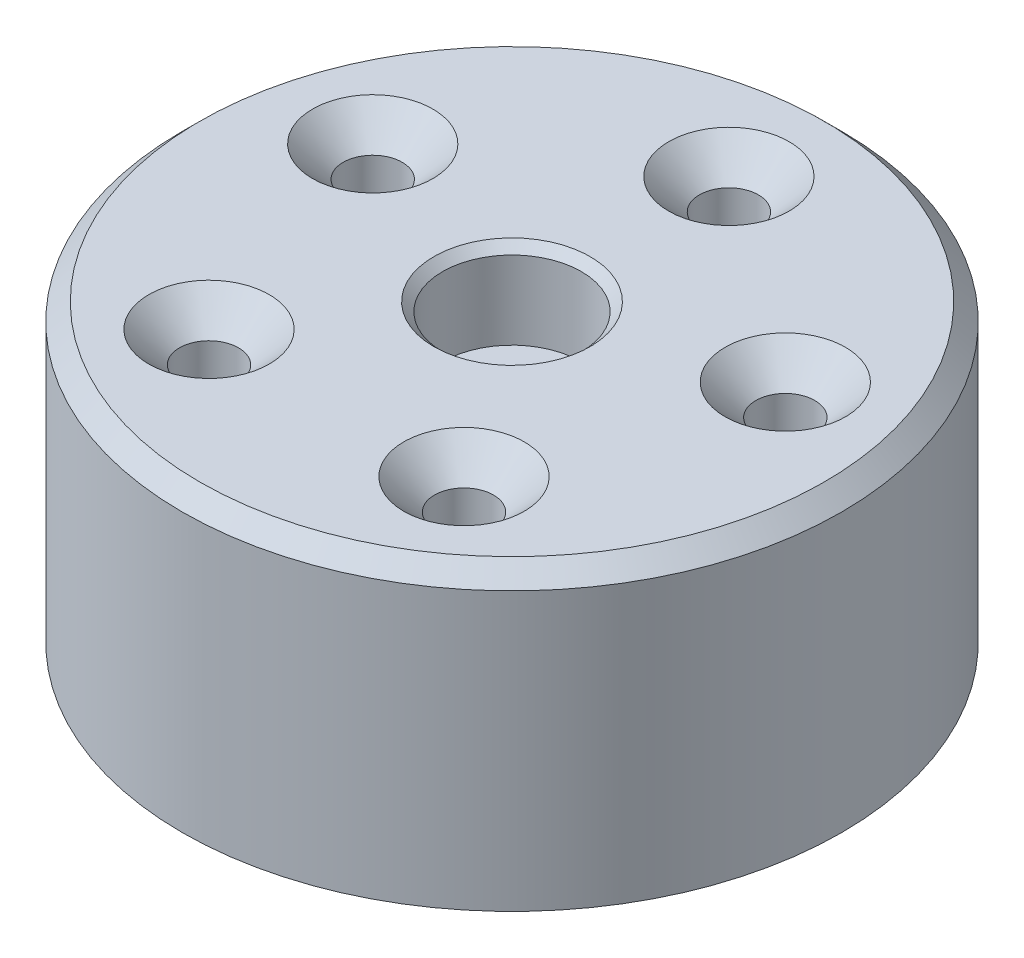
ISO-10303-21;
HEADER;
FILE_DESCRIPTION(('STEP AP214'),'2;1');
FILE_NAME('part.step','',(''),(''),'','','');
FILE_SCHEMA(('AUTOMOTIVE_DESIGN { 1 0 10303 214 1 1 1 1 }'));
ENDSEC;
DATA;
#1=APPLICATION_CONTEXT('core data for automotive mechanical design processes');
#2=APPLICATION_PROTOCOL_DEFINITION('international standard','automotive_design',2000,#1);
#3=PRODUCT_CONTEXT('',#1,'mechanical');
#4=PRODUCT('Part','Part','',(#3));
#5=PRODUCT_RELATED_PRODUCT_CATEGORY('part','',(#4));
#6=PRODUCT_DEFINITION_FORMATION('','',#4);
#7=PRODUCT_DEFINITION_CONTEXT('part definition',#1,'design');
#8=PRODUCT_DEFINITION('design','',#6,#7);
#9=PRODUCT_DEFINITION_SHAPE('','',#8);
#10=(LENGTH_UNIT() NAMED_UNIT(*) SI_UNIT(.MILLI.,.METRE.));
#11=(NAMED_UNIT(*) PLANE_ANGLE_UNIT() SI_UNIT($,.RADIAN.));
#12=(NAMED_UNIT(*) SI_UNIT($,.STERADIAN.) SOLID_ANGLE_UNIT());
#13=UNCERTAINTY_MEASURE_WITH_UNIT(LENGTH_MEASURE(1.E-05),#10,'distance_accuracy_value','');
#14=(GEOMETRIC_REPRESENTATION_CONTEXT(3) GLOBAL_UNCERTAINTY_ASSIGNED_CONTEXT((#13)) GLOBAL_UNIT_ASSIGNED_CONTEXT((#10,
#11,#12)) REPRESENTATION_CONTEXT('',''));
#15=CARTESIAN_POINT('',(0.,0.,0.));
#16=DIRECTION('',(0.,0.,1.));
#17=DIRECTION('',(1.,0.,0.));
#18=AXIS2_PLACEMENT_3D('',#15,#16,#17);
#19=CARTESIAN_POINT('',(0.,0.,0.));
#20=DIRECTION('',(0.,-1.,0.));
#21=DIRECTION('',(0.,0.,-1.));
#22=AXIS2_PLACEMENT_3D('',#19,#20,#21);
#23=CYLINDRICAL_SURFACE('',#22,17.);
#24=CARTESIAN_POINT('',(0.,0.,0.));
#25=DIRECTION('',(0.,-1.,0.));
#26=DIRECTION('',(0.,0.,-1.));
#27=AXIS2_PLACEMENT_3D('',#24,#25,#26);
#28=CIRCLE('',#27,17.);
#29=CARTESIAN_POINT('',(0.,0.,-17.));
#30=VERTEX_POINT('',#29);
#31=EDGE_CURVE('E77',#30,#30,#28,.T.);
#32=ORIENTED_EDGE('',*,*,#31,.T.);
#33=EDGE_LOOP('',(#32));
#34=FACE_BOUND('',#33,.T.);
#35=CARTESIAN_POINT('',(0.,2.,0.));
#36=DIRECTION('',(0.,-1.,0.));
#37=DIRECTION('',(0.,0.,-1.));
#38=AXIS2_PLACEMENT_3D('',#35,#36,#37);
#39=CIRCLE('',#38,17.);
#40=CARTESIAN_POINT('',(0.,2.,-17.));
#41=VERTEX_POINT('',#40);
#42=EDGE_CURVE('E106',#41,#41,#39,.T.);
#43=ORIENTED_EDGE('',*,*,#42,.F.);
#44=EDGE_LOOP('',(#43));
#45=FACE_BOUND('',#44,.T.);
#46=ADVANCED_FACE('F44',(#34,#45),#23,.F.);
#47=CARTESIAN_POINT('',(17.,0.,0.));
#48=DIRECTION('',(0.,-1.,0.));
#49=DIRECTION('',(0.,0.,-1.));
#50=AXIS2_PLACEMENT_3D('',#47,#48,#49);
#51=PLANE('',#50);
#52=CARTESIAN_POINT('',(0.,0.,0.));
#53=DIRECTION('',(0.,-1.,0.));
#54=DIRECTION('',(0.,0.,-1.));
#55=AXIS2_PLACEMENT_3D('',#52,#53,#54);
#56=CIRCLE('',#55,19.);
#57=CARTESIAN_POINT('',(0.,0.,-19.));
#58=VERTEX_POINT('',#57);
#59=EDGE_CURVE('E111',#58,#58,#56,.T.);
#60=ORIENTED_EDGE('',*,*,#59,.T.);
#61=EDGE_LOOP('',(#60));
#62=FACE_BOUND('',#61,.T.);
#63=ORIENTED_EDGE('',*,*,#31,.F.);
#64=EDGE_LOOP('',(#63));
#65=FACE_BOUND('',#64,.T.);
#66=ADVANCED_FACE('F179',(#62,#65),#51,.T.);
#67=CARTESIAN_POINT('',(0.,0.,0.));
#68=DIRECTION('',(0.,-1.,0.));
#69=DIRECTION('',(0.,0.,-1.));
#70=AXIS2_PLACEMENT_3D('',#67,#68,#69);
#71=CYLINDRICAL_SURFACE('',#70,19.);
#72=CARTESIAN_POINT('',(0.,16.,0.));
#73=DIRECTION('',(0.,1.,0.));
#74=DIRECTION('',(0.,0.,1.));
#75=AXIS2_PLACEMENT_3D('',#72,#73,#74);
#76=CIRCLE('',#75,19.);
#77=CARTESIAN_POINT('',(0.,16.,19.));
#78=VERTEX_POINT('',#77);
#79=EDGE_CURVE('E63',#78,#78,#76,.F.);
#80=ORIENTED_EDGE('',*,*,#79,.T.);
#81=EDGE_LOOP('',(#80));
#82=FACE_BOUND('',#81,.T.);
#83=ORIENTED_EDGE('',*,*,#59,.F.);
#84=EDGE_LOOP('',(#83));
#85=FACE_BOUND('',#84,.T.);
#86=ADVANCED_FACE('F185',(#82,#85),#71,.T.);
#87=CARTESIAN_POINT('',(19.,17.,0.));
#88=DIRECTION('',(0.,1.,0.));
#89=DIRECTION('',(0.,0.,1.));
#90=AXIS2_PLACEMENT_3D('',#87,#88,#89);
#91=PLANE('',#90);
#92=CARTESIAN_POINT('',(0.,17.,0.));
#93=DIRECTION('',(0.,1.,0.));
#94=DIRECTION('',(0.,0.,1.));
#95=AXIS2_PLACEMENT_3D('',#92,#93,#94);
#96=CIRCLE('',#95,4.5);
#97=CARTESIAN_POINT('',(0.,17.,4.5));
#98=VERTEX_POINT('',#97);
#99=EDGE_CURVE('E53',#98,#98,#96,.F.);
#100=ORIENTED_EDGE('',*,*,#99,.T.);
#101=EDGE_LOOP('',(#100));
#102=FACE_BOUND('',#101,.T.);
#103=CARTESIAN_POINT('',(0.,17.,0.));
#104=DIRECTION('',(0.,1.,0.));
#105=DIRECTION('',(0.,0.,1.));
#106=AXIS2_PLACEMENT_3D('',#103,#104,#105);
#107=CIRCLE('',#106,18.);
#108=CARTESIAN_POINT('',(0.,17.,18.));
#109=VERTEX_POINT('',#108);
#110=EDGE_CURVE('E58',#109,#109,#107,.T.);
#111=ORIENTED_EDGE('',*,*,#110,.T.);
#112=EDGE_LOOP('',(#111));
#113=FACE_BOUND('',#112,.T.);
#114=CARTESIAN_POINT('',(0.,17.,-12.5));
#115=DIRECTION('',(0.,1.,0.));
#116=DIRECTION('',(0.,0.,1.));
#117=AXIS2_PLACEMENT_3D('',#114,#115,#116);
#118=CIRCLE('',#117,3.47);
#119=CARTESIAN_POINT('',(0.,17.,-9.03));
#120=VERTEX_POINT('',#119);
#121=EDGE_CURVE('E149',#120,#120,#118,.T.);
#122=ORIENTED_EDGE('',*,*,#121,.F.);
#123=EDGE_LOOP('',(#122));
#124=FACE_BOUND('',#123,.T.);
#125=CARTESIAN_POINT('',(11.8882064536898,17.,-3.86271242968735));
#126=DIRECTION('',(0.,1.,0.));
#127=DIRECTION('',(0.,0.,1.));
#128=AXIS2_PLACEMENT_3D('',#125,#126,#127);
#129=CIRCLE('',#128,3.47);
#130=CARTESIAN_POINT('',(11.8882064536898,17.,-0.392712429687347));
#131=VERTEX_POINT('',#130);
#132=EDGE_CURVE('E82',#131,#131,#129,.T.);
#133=ORIENTED_EDGE('',*,*,#132,.F.);
#134=EDGE_LOOP('',(#133));
#135=FACE_BOUND('',#134,.T.);
#136=CARTESIAN_POINT('',(7.34731565365687,17.,10.1127124296865));
#137=DIRECTION('',(0.,1.,0.));
#138=DIRECTION('',(0.,0.,1.));
#139=AXIS2_PLACEMENT_3D('',#136,#137,#138);
#140=CIRCLE('',#139,3.47);
#141=CARTESIAN_POINT('',(7.34731565365687,17.,13.5827124296865));
#142=VERTEX_POINT('',#141);
#143=EDGE_CURVE('E88',#142,#142,#140,.T.);
#144=ORIENTED_EDGE('',*,*,#143,.F.);
#145=EDGE_LOOP('',(#144));
#146=FACE_BOUND('',#145,.T.);
#147=CARTESIAN_POINT('',(-7.34731565365496,17.,10.1127124296872));
#148=DIRECTION('',(0.,1.,0.));
#149=DIRECTION('',(0.,0.,1.));
#150=AXIS2_PLACEMENT_3D('',#147,#148,#149);
#151=CIRCLE('',#150,3.47);
#152=CARTESIAN_POINT('',(-7.34731565365496,17.,13.5827124296872));
#153=VERTEX_POINT('',#152);
#154=EDGE_CURVE('E94',#153,#153,#151,.T.);
#155=ORIENTED_EDGE('',*,*,#154,.F.);
#156=EDGE_LOOP('',(#155));
#157=FACE_BOUND('',#156,.T.);
#158=CARTESIAN_POINT('',(-11.8882064536891,17.,-3.86271242968634));
#159=DIRECTION('',(0.,1.,0.));
#160=DIRECTION('',(0.,0.,1.));
#161=AXIS2_PLACEMENT_3D('',#158,#159,#160);
#162=CIRCLE('',#161,3.47);
#163=CARTESIAN_POINT('',(-11.8882064536891,17.,-0.39271242968634));
#164=VERTEX_POINT('',#163);
#165=EDGE_CURVE('E100',#164,#164,#162,.T.);
#166=ORIENTED_EDGE('',*,*,#165,.F.);
#167=EDGE_LOOP('',(#166));
#168=FACE_BOUND('',#167,.T.);
#169=ADVANCED_FACE('F214',(#102,#113,#124,#135,#146,#157,#168),#91,.T.);
#170=CARTESIAN_POINT('',(0.,0.,0.));
#171=DIRECTION('',(0.,-1.,0.));
#172=DIRECTION('',(0.,0.,-1.));
#173=AXIS2_PLACEMENT_3D('',#170,#171,#172);
#174=CYLINDRICAL_SURFACE('',#173,4.);
#175=CARTESIAN_POINT('',(0.,16.5,0.));
#176=DIRECTION('',(0.,1.,0.));
#177=DIRECTION('',(0.,0.,1.));
#178=AXIS2_PLACEMENT_3D('',#175,#176,#177);
#179=CIRCLE('',#178,4.);
#180=CARTESIAN_POINT('',(0.,16.5,4.));
#181=VERTEX_POINT('',#180);
#182=EDGE_CURVE('E10',#181,#181,#179,.T.);
#183=ORIENTED_EDGE('',*,*,#182,.T.);
#184=EDGE_LOOP('',(#183));
#185=FACE_BOUND('',#184,.T.);
#186=CARTESIAN_POINT('',(0.,12.,0.));
#187=DIRECTION('',(0.,-1.,0.));
#188=DIRECTION('',(0.,0.,-1.));
#189=AXIS2_PLACEMENT_3D('',#186,#187,#188);
#190=CIRCLE('',#189,4.);
#191=CARTESIAN_POINT('',(0.,12.,-4.));
#192=VERTEX_POINT('',#191);
#193=EDGE_CURVE('E115',#192,#192,#190,.T.);
#194=ORIENTED_EDGE('',*,*,#193,.T.);
#195=EDGE_LOOP('',(#194));
#196=FACE_BOUND('',#195,.T.);
#197=ADVANCED_FACE('F220',(#185,#196),#174,.F.);
#198=CARTESIAN_POINT('',(4.,12.,0.));
#199=DIRECTION('',(0.,1.,0.));
#200=DIRECTION('',(0.,0.,1.));
#201=AXIS2_PLACEMENT_3D('',#198,#199,#200);
#202=PLANE('',#201);
#203=ORIENTED_EDGE('',*,*,#193,.F.);
#204=EDGE_LOOP('',(#203));
#205=FACE_BOUND('',#204,.T.);
#206=ADVANCED_FACE('F164',(#205),#202,.T.);
#207=CARTESIAN_POINT('',(0.,2.,0.));
#208=DIRECTION('',(0.,-1.,0.));
#209=DIRECTION('',(0.,0.,-1.));
#210=AXIS2_PLACEMENT_3D('',#207,#208,#209);
#211=PLANE('',#210);
#212=CARTESIAN_POINT('',(0.,2.,0.));
#213=DIRECTION('',(0.,-1.,0.));
#214=DIRECTION('',(0.,0.,-1.));
#215=AXIS2_PLACEMENT_3D('',#212,#213,#214);
#216=CIRCLE('',#215,7.5);
#217=CARTESIAN_POINT('',(0.,2.,-7.5));
#218=VERTEX_POINT('',#217);
#219=EDGE_CURVE('E153',#218,#218,#216,.T.);
#220=ORIENTED_EDGE('',*,*,#219,.F.);
#221=EDGE_LOOP('',(#220));
#222=FACE_BOUND('',#221,.T.);
#223=CARTESIAN_POINT('',(0.,2.,-12.5));
#224=DIRECTION('',(0.,-1.,0.));
#225=DIRECTION('',(0.,0.,-1.));
#226=AXIS2_PLACEMENT_3D('',#223,#224,#225);
#227=CIRCLE('',#226,1.7);
#228=CARTESIAN_POINT('',(0.,2.,-14.2));
#229=VERTEX_POINT('',#228);
#230=EDGE_CURVE('E78',#229,#229,#227,.T.);
#231=ORIENTED_EDGE('',*,*,#230,.F.);
#232=EDGE_LOOP('',(#231));
#233=FACE_BOUND('',#232,.T.);
#234=CARTESIAN_POINT('',(11.8882064536898,2.,-3.86271242968735));
#235=DIRECTION('',(0.,-1.,0.));
#236=DIRECTION('',(0.,0.,-1.));
#237=AXIS2_PLACEMENT_3D('',#234,#235,#236);
#238=CIRCLE('',#237,1.7);
#239=CARTESIAN_POINT('',(11.8882064536898,2.,-5.56271242968735));
#240=VERTEX_POINT('',#239);
#241=EDGE_CURVE('E84',#240,#240,#238,.T.);
#242=ORIENTED_EDGE('',*,*,#241,.F.);
#243=EDGE_LOOP('',(#242));
#244=FACE_BOUND('',#243,.T.);
#245=CARTESIAN_POINT('',(7.34731565365687,2.,10.1127124296865));
#246=DIRECTION('',(0.,-1.,0.));
#247=DIRECTION('',(0.,0.,-1.));
#248=AXIS2_PLACEMENT_3D('',#245,#246,#247);
#249=CIRCLE('',#248,1.7);
#250=CARTESIAN_POINT('',(7.34731565365687,2.,8.41271242968653));
#251=VERTEX_POINT('',#250);
#252=EDGE_CURVE('E90',#251,#251,#249,.T.);
#253=ORIENTED_EDGE('',*,*,#252,.F.);
#254=EDGE_LOOP('',(#253));
#255=FACE_BOUND('',#254,.T.);
#256=CARTESIAN_POINT('',(-7.34731565365496,2.,10.1127124296872));
#257=DIRECTION('',(0.,-1.,0.));
#258=DIRECTION('',(0.,0.,-1.));
#259=AXIS2_PLACEMENT_3D('',#256,#257,#258);
#260=CIRCLE('',#259,1.7);
#261=CARTESIAN_POINT('',(-7.34731565365496,2.,8.41271242968716));
#262=VERTEX_POINT('',#261);
#263=EDGE_CURVE('E96',#262,#262,#260,.T.);
#264=ORIENTED_EDGE('',*,*,#263,.F.);
#265=EDGE_LOOP('',(#264));
#266=FACE_BOUND('',#265,.T.);
#267=CARTESIAN_POINT('',(-11.8882064536891,2.,-3.86271242968634));
#268=DIRECTION('',(0.,-1.,0.));
#269=DIRECTION('',(0.,0.,-1.));
#270=AXIS2_PLACEMENT_3D('',#267,#268,#269);
#271=CIRCLE('',#270,1.7);
#272=CARTESIAN_POINT('',(-11.8882064536891,2.,-5.56271242968634));
#273=VERTEX_POINT('',#272);
#274=EDGE_CURVE('E102',#273,#273,#271,.T.);
#275=ORIENTED_EDGE('',*,*,#274,.F.);
#276=EDGE_LOOP('',(#275));
#277=FACE_BOUND('',#276,.T.);
#278=ORIENTED_EDGE('',*,*,#42,.T.);
#279=EDGE_LOOP('',(#278));
#280=FACE_BOUND('',#279,.T.);
#281=ADVANCED_FACE('F160',(#222,#233,#244,#255,#266,#277,#280),#211,.T.);
#282=CARTESIAN_POINT('',(-11.8882064536891,17.,-3.86271242968634));
#283=DIRECTION('',(0.,1.,0.));
#284=DIRECTION('',(0.,0.,1.));
#285=AXIS2_PLACEMENT_3D('',#282,#283,#284);
#286=CYLINDRICAL_SURFACE('',#285,1.7);
#287=ORIENTED_EDGE('',*,*,#274,.T.);
#288=EDGE_LOOP('',(#287));
#289=FACE_BOUND('',#288,.T.);
#290=CARTESIAN_POINT('',(-11.8882064536891,15.23,-3.86271242968634));
#291=DIRECTION('',(0.,1.,0.));
#292=DIRECTION('',(0.,0.,1.));
#293=AXIS2_PLACEMENT_3D('',#290,#291,#292);
#294=CIRCLE('',#293,1.7);
#295=CARTESIAN_POINT('',(-11.8882064536891,15.23,-2.16271242968634));
#296=VERTEX_POINT('',#295);
#297=EDGE_CURVE('E107',#296,#296,#294,.T.);
#298=ORIENTED_EDGE('',*,*,#297,.T.);
#299=EDGE_LOOP('',(#298));
#300=FACE_BOUND('',#299,.T.);
#301=ADVANCED_FACE('F163',(#289,#300),#286,.F.);
#302=CARTESIAN_POINT('',(-11.8882064536891,17.,-3.86271242968634));
#303=DIRECTION('',(0.,1.,0.));
#304=DIRECTION('',(0.,0.,1.));
#305=AXIS2_PLACEMENT_3D('',#302,#303,#304);
#306=CONICAL_SURFACE('',#305,3.47,0.785398163397448);
#307=ORIENTED_EDGE('',*,*,#297,.F.);
#308=EDGE_LOOP('',(#307));
#309=FACE_BOUND('',#308,.T.);
#310=ORIENTED_EDGE('',*,*,#165,.T.);
#311=EDGE_LOOP('',(#310));
#312=FACE_BOUND('',#311,.T.);
#313=ADVANCED_FACE('F230',(#309,#312),#306,.F.);
#314=CARTESIAN_POINT('',(-7.34731565365496,17.,10.1127124296872));
#315=DIRECTION('',(0.,1.,0.));
#316=DIRECTION('',(0.,0.,1.));
#317=AXIS2_PLACEMENT_3D('',#314,#315,#316);
#318=CYLINDRICAL_SURFACE('',#317,1.7);
#319=ORIENTED_EDGE('',*,*,#263,.T.);
#320=EDGE_LOOP('',(#319));
#321=FACE_BOUND('',#320,.T.);
#322=CARTESIAN_POINT('',(-7.34731565365496,15.23,10.1127124296872));
#323=DIRECTION('',(0.,1.,0.));
#324=DIRECTION('',(0.,0.,1.));
#325=AXIS2_PLACEMENT_3D('',#322,#323,#324);
#326=CIRCLE('',#325,1.7);
#327=CARTESIAN_POINT('',(-7.34731565365496,15.23,11.8127124296872));
#328=VERTEX_POINT('',#327);
#329=EDGE_CURVE('E101',#328,#328,#326,.T.);
#330=ORIENTED_EDGE('',*,*,#329,.T.);
#331=EDGE_LOOP('',(#330));
#332=FACE_BOUND('',#331,.T.);
#333=ADVANCED_FACE('F234',(#321,#332),#318,.F.);
#334=CARTESIAN_POINT('',(-7.34731565365496,17.,10.1127124296872));
#335=DIRECTION('',(0.,1.,0.));
#336=DIRECTION('',(0.,0.,1.));
#337=AXIS2_PLACEMENT_3D('',#334,#335,#336);
#338=CONICAL_SURFACE('',#337,3.47,0.785398163397448);
#339=ORIENTED_EDGE('',*,*,#329,.F.);
#340=EDGE_LOOP('',(#339));
#341=FACE_BOUND('',#340,.T.);
#342=ORIENTED_EDGE('',*,*,#154,.T.);
#343=EDGE_LOOP('',(#342));
#344=FACE_BOUND('',#343,.T.);
#345=ADVANCED_FACE('F238',(#341,#344),#338,.F.);
#346=CARTESIAN_POINT('',(7.34731565365687,17.,10.1127124296865));
#347=DIRECTION('',(0.,1.,0.));
#348=DIRECTION('',(0.,0.,1.));
#349=AXIS2_PLACEMENT_3D('',#346,#347,#348);
#350=CYLINDRICAL_SURFACE('',#349,1.7);
#351=ORIENTED_EDGE('',*,*,#252,.T.);
#352=EDGE_LOOP('',(#351));
#353=FACE_BOUND('',#352,.T.);
#354=CARTESIAN_POINT('',(7.34731565365687,15.23,10.1127124296865));
#355=DIRECTION('',(0.,1.,0.));
#356=DIRECTION('',(0.,0.,1.));
#357=AXIS2_PLACEMENT_3D('',#354,#355,#356);
#358=CIRCLE('',#357,1.7);
#359=CARTESIAN_POINT('',(7.34731565365687,15.23,11.8127124296865));
#360=VERTEX_POINT('',#359);
#361=EDGE_CURVE('E95',#360,#360,#358,.T.);
#362=ORIENTED_EDGE('',*,*,#361,.T.);
#363=EDGE_LOOP('',(#362));
#364=FACE_BOUND('',#363,.T.);
#365=ADVANCED_FACE('F242',(#353,#364),#350,.F.);
#366=CARTESIAN_POINT('',(7.34731565365687,17.,10.1127124296865));
#367=DIRECTION('',(0.,1.,0.));
#368=DIRECTION('',(0.,0.,1.));
#369=AXIS2_PLACEMENT_3D('',#366,#367,#368);
#370=CONICAL_SURFACE('',#369,3.47,0.785398163397448);
#371=ORIENTED_EDGE('',*,*,#361,.F.);
#372=EDGE_LOOP('',(#371));
#373=FACE_BOUND('',#372,.T.);
#374=ORIENTED_EDGE('',*,*,#143,.T.);
#375=EDGE_LOOP('',(#374));
#376=FACE_BOUND('',#375,.T.);
#377=ADVANCED_FACE('F246',(#373,#376),#370,.F.);
#378=CARTESIAN_POINT('',(11.8882064536898,17.,-3.86271242968735));
#379=DIRECTION('',(0.,1.,0.));
#380=DIRECTION('',(0.,0.,1.));
#381=AXIS2_PLACEMENT_3D('',#378,#379,#380);
#382=CYLINDRICAL_SURFACE('',#381,1.7);
#383=ORIENTED_EDGE('',*,*,#241,.T.);
#384=EDGE_LOOP('',(#383));
#385=FACE_BOUND('',#384,.T.);
#386=CARTESIAN_POINT('',(11.8882064536898,15.23,-3.86271242968735));
#387=DIRECTION('',(0.,1.,0.));
#388=DIRECTION('',(0.,0.,1.));
#389=AXIS2_PLACEMENT_3D('',#386,#387,#388);
#390=CIRCLE('',#389,1.7);
#391=CARTESIAN_POINT('',(11.8882064536898,15.23,-2.16271242968735));
#392=VERTEX_POINT('',#391);
#393=EDGE_CURVE('E89',#392,#392,#390,.T.);
#394=ORIENTED_EDGE('',*,*,#393,.T.);
#395=EDGE_LOOP('',(#394));
#396=FACE_BOUND('',#395,.T.);
#397=ADVANCED_FACE('F250',(#385,#396),#382,.F.);
#398=CARTESIAN_POINT('',(11.8882064536898,17.,-3.86271242968735));
#399=DIRECTION('',(0.,1.,0.));
#400=DIRECTION('',(0.,0.,1.));
#401=AXIS2_PLACEMENT_3D('',#398,#399,#400);
#402=CONICAL_SURFACE('',#401,3.47,0.785398163397448);
#403=ORIENTED_EDGE('',*,*,#393,.F.);
#404=EDGE_LOOP('',(#403));
#405=FACE_BOUND('',#404,.T.);
#406=ORIENTED_EDGE('',*,*,#132,.T.);
#407=EDGE_LOOP('',(#406));
#408=FACE_BOUND('',#407,.T.);
#409=ADVANCED_FACE('F254',(#405,#408),#402,.F.);
#410=CARTESIAN_POINT('',(0.,17.,-12.5));
#411=DIRECTION('',(0.,1.,0.));
#412=DIRECTION('',(0.,0.,1.));
#413=AXIS2_PLACEMENT_3D('',#410,#411,#412);
#414=CYLINDRICAL_SURFACE('',#413,1.7);
#415=ORIENTED_EDGE('',*,*,#230,.T.);
#416=EDGE_LOOP('',(#415));
#417=FACE_BOUND('',#416,.T.);
#418=CARTESIAN_POINT('',(0.,15.23,-12.5));
#419=DIRECTION('',(0.,1.,0.));
#420=DIRECTION('',(0.,0.,1.));
#421=AXIS2_PLACEMENT_3D('',#418,#419,#420);
#422=CIRCLE('',#421,1.7);
#423=CARTESIAN_POINT('',(0.,15.23,-10.8));
#424=VERTEX_POINT('',#423);
#425=EDGE_CURVE('E83',#424,#424,#422,.T.);
#426=ORIENTED_EDGE('',*,*,#425,.T.);
#427=EDGE_LOOP('',(#426));
#428=FACE_BOUND('',#427,.T.);
#429=ADVANCED_FACE('F258',(#417,#428),#414,.F.);
#430=CARTESIAN_POINT('',(0.,17.,-12.5));
#431=DIRECTION('',(0.,1.,0.));
#432=DIRECTION('',(0.,0.,1.));
#433=AXIS2_PLACEMENT_3D('',#430,#431,#432);
#434=CONICAL_SURFACE('',#433,3.47,0.785398163397448);
#435=ORIENTED_EDGE('',*,*,#425,.F.);
#436=EDGE_LOOP('',(#435));
#437=FACE_BOUND('',#436,.T.);
#438=ORIENTED_EDGE('',*,*,#121,.T.);
#439=EDGE_LOOP('',(#438));
#440=FACE_BOUND('',#439,.T.);
#441=ADVANCED_FACE('F262',(#437,#440),#434,.F.);
#442=CARTESIAN_POINT('',(0.,7.,0.));
#443=DIRECTION('',(0.,-1.,0.));
#444=DIRECTION('',(0.,0.,-1.));
#445=AXIS2_PLACEMENT_3D('',#442,#443,#444);
#446=CYLINDRICAL_SURFACE('',#445,7.5);
#447=CARTESIAN_POINT('',(0.,4.00000000000002,0.));
#448=DIRECTION('',(0.,-1.,0.));
#449=DIRECTION('',(0.,0.,-1.));
#450=AXIS2_PLACEMENT_3D('',#447,#448,#449);
#451=CIRCLE('',#450,7.5);
#452=CARTESIAN_POINT('',(0.,4.00000000000002,-7.5));
#453=VERTEX_POINT('',#452);
#454=EDGE_CURVE('E69',#453,#453,#451,.F.);
#455=ORIENTED_EDGE('',*,*,#454,.T.);
#456=EDGE_LOOP('',(#455));
#457=FACE_BOUND('',#456,.T.);
#458=ORIENTED_EDGE('',*,*,#219,.T.);
#459=EDGE_LOOP('',(#458));
#460=FACE_BOUND('',#459,.T.);
#461=ADVANCED_FACE('F158',(#457,#460),#446,.F.);
#462=CARTESIAN_POINT('',(0.,7.,0.));
#463=DIRECTION('',(0.,-1.,0.));
#464=DIRECTION('',(0.,0.,-1.));
#465=AXIS2_PLACEMENT_3D('',#462,#463,#464);
#466=PLANE('',#465);
#467=CARTESIAN_POINT('',(0.,7.,0.));
#468=DIRECTION('',(0.,-1.,0.));
#469=DIRECTION('',(0.,0.,-1.));
#470=AXIS2_PLACEMENT_3D('',#467,#468,#469);
#471=CIRCLE('',#470,4.49999999999998);
#472=CARTESIAN_POINT('',(0.,7.,-4.49999999999998));
#473=VERTEX_POINT('',#472);
#474=EDGE_CURVE('E73',#473,#473,#471,.T.);
#475=ORIENTED_EDGE('',*,*,#474,.T.);
#476=EDGE_LOOP('',(#475));
#477=FACE_BOUND('',#476,.T.);
#478=ADVANCED_FACE('F197',(#477),#466,.T.);
#479=CARTESIAN_POINT('',(0.,7.,0.));
#480=DIRECTION('',(0.,-1.,0.));
#481=DIRECTION('',(0.,0.,-1.));
#482=AXIS2_PLACEMENT_3D('',#479,#480,#481);
#483=CONICAL_SURFACE('',#482,4.49999999999998,0.785398163397454);
#484=ORIENTED_EDGE('',*,*,#454,.F.);
#485=EDGE_LOOP('',(#484));
#486=FACE_BOUND('',#485,.T.);
#487=ORIENTED_EDGE('',*,*,#474,.F.);
#488=EDGE_LOOP('',(#487));
#489=FACE_BOUND('',#488,.T.);
#490=ADVANCED_FACE('F191',(#486,#489),#483,.F.);
#491=CARTESIAN_POINT('',(0.,16.,0.));
#492=DIRECTION('',(0.,-1.,0.));
#493=DIRECTION('',(0.,0.,-1.));
#494=AXIS2_PLACEMENT_3D('',#491,#492,#493);
#495=CONICAL_SURFACE('',#494,19.,0.785398163397447);
#496=ORIENTED_EDGE('',*,*,#110,.F.);
#497=EDGE_LOOP('',(#496));
#498=FACE_BOUND('',#497,.T.);
#499=ORIENTED_EDGE('',*,*,#79,.F.);
#500=EDGE_LOOP('',(#499));
#501=FACE_BOUND('',#500,.T.);
#502=ADVANCED_FACE('F196',(#498,#501),#495,.T.);
#503=CARTESIAN_POINT('',(0.,17.,0.));
#504=DIRECTION('',(0.,1.,0.));
#505=DIRECTION('',(0.,0.,1.));
#506=AXIS2_PLACEMENT_3D('',#503,#504,#505);
#507=CONICAL_SURFACE('',#506,4.5,0.785398163397448);
#508=ORIENTED_EDGE('',*,*,#182,.F.);
#509=EDGE_LOOP('',(#508));
#510=FACE_BOUND('',#509,.T.);
#511=ORIENTED_EDGE('',*,*,#99,.F.);
#512=EDGE_LOOP('',(#511));
#513=FACE_BOUND('',#512,.T.);
#514=ADVANCED_FACE('F47',(#510,#513),#507,.F.);
#515=CLOSED_SHELL('',(#46,#66,#86,#169,#197,#206,#281,#301,#313,#333,#345,#365,#377,#397,#409,
#429,#441,#461,#478,#490,#502,#514));
#516=MANIFOLD_SOLID_BREP('B2',#515);
#517=ADVANCED_BREP_SHAPE_REPRESENTATION('',(#18,#516),#14);
#518=SHAPE_DEFINITION_REPRESENTATION(#9,#517);
ENDSEC;
END-ISO-10303-21;
